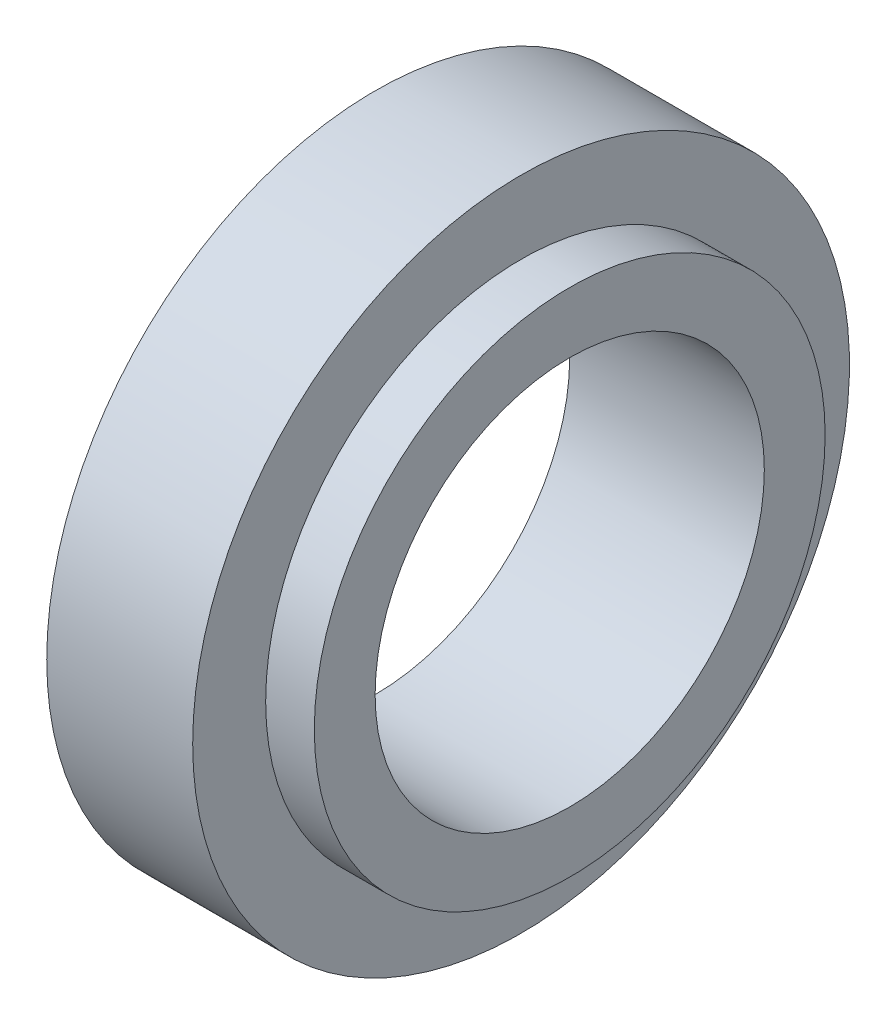
ISO-10303-21;
HEADER;
FILE_DESCRIPTION(('STEP AP214'),'2;1');
FILE_NAME('part.step','',(''),(''),'','','');
FILE_SCHEMA(('AUTOMOTIVE_DESIGN { 1 0 10303 214 1 1 1 1 }'));
ENDSEC;
DATA;
#1=APPLICATION_CONTEXT('core data for automotive mechanical design processes');
#2=APPLICATION_PROTOCOL_DEFINITION('international standard','automotive_design',2000,#1);
#3=PRODUCT_CONTEXT('',#1,'mechanical');
#4=PRODUCT('Part','Part','',(#3));
#5=PRODUCT_RELATED_PRODUCT_CATEGORY('part','',(#4));
#6=PRODUCT_DEFINITION_FORMATION('','',#4);
#7=PRODUCT_DEFINITION_CONTEXT('part definition',#1,'design');
#8=PRODUCT_DEFINITION('design','',#6,#7);
#9=PRODUCT_DEFINITION_SHAPE('','',#8);
#10=(LENGTH_UNIT() NAMED_UNIT(*) SI_UNIT(.MILLI.,.METRE.));
#11=(NAMED_UNIT(*) PLANE_ANGLE_UNIT() SI_UNIT($,.RADIAN.));
#12=(NAMED_UNIT(*) SI_UNIT($,.STERADIAN.) SOLID_ANGLE_UNIT());
#13=UNCERTAINTY_MEASURE_WITH_UNIT(LENGTH_MEASURE(1.E-05),#10,'distance_accuracy_value','');
#14=(GEOMETRIC_REPRESENTATION_CONTEXT(3) GLOBAL_UNCERTAINTY_ASSIGNED_CONTEXT((#13)) GLOBAL_UNIT_ASSIGNED_CONTEXT((#10,
#11,#12)) REPRESENTATION_CONTEXT('',''));
#15=CARTESIAN_POINT('',(0.,0.,0.));
#16=DIRECTION('',(0.,0.,1.));
#17=DIRECTION('',(1.,0.,0.));
#18=AXIS2_PLACEMENT_3D('',#15,#16,#17);
#19=CARTESIAN_POINT('',(-5.1063829787234,0.,0.));
#20=DIRECTION('',(-1.,0.,0.));
#21=DIRECTION('',(0.,0.,1.));
#22=AXIS2_PLACEMENT_3D('',#19,#20,#21);
#23=CYLINDRICAL_SURFACE('',#22,13.5);
#24=CARTESIAN_POINT('',(0.,0.,0.));
#25=DIRECTION('',(-1.,0.,0.));
#26=DIRECTION('',(0.,0.,1.));
#27=AXIS2_PLACEMENT_3D('',#24,#25,#26);
#28=CIRCLE('',#27,13.5);
#29=CARTESIAN_POINT('',(0.,0.,13.5));
#30=VERTEX_POINT('',#29);
#31=EDGE_CURVE('E64',#30,#30,#28,.T.);
#32=ORIENTED_EDGE('',*,*,#31,.F.);
#33=EDGE_LOOP('',(#32));
#34=FACE_BOUND('',#33,.T.);
#35=CARTESIAN_POINT('',(6.,0.,0.));
#36=DIRECTION('',(-1.,0.,0.));
#37=DIRECTION('',(0.,0.,1.));
#38=AXIS2_PLACEMENT_3D('',#35,#36,#37);
#39=CIRCLE('',#38,13.5);
#40=CARTESIAN_POINT('',(6.,0.,13.5));
#41=VERTEX_POINT('',#40);
#42=EDGE_CURVE('E10',#41,#41,#39,.T.);
#43=ORIENTED_EDGE('',*,*,#42,.T.);
#44=EDGE_LOOP('',(#43));
#45=FACE_BOUND('',#44,.T.);
#46=ADVANCED_FACE('F37',(#34,#45),#23,.T.);
#47=CARTESIAN_POINT('',(6.,13.5,0.));
#48=DIRECTION('',(-1.,0.,0.));
#49=DIRECTION('',(0.,0.,1.));
#50=AXIS2_PLACEMENT_3D('',#47,#48,#49);
#51=PLANE('',#50);
#52=ORIENTED_EDGE('',*,*,#42,.F.);
#53=EDGE_LOOP('',(#52));
#54=FACE_BOUND('',#53,.T.);
#55=CARTESIAN_POINT('',(6.,0.,0.));
#56=DIRECTION('',(-1.,0.,0.));
#57=DIRECTION('',(0.,0.,1.));
#58=AXIS2_PLACEMENT_3D('',#55,#56,#57);
#59=CIRCLE('',#58,10.5);
#60=CARTESIAN_POINT('',(6.,0.,10.5));
#61=VERTEX_POINT('',#60);
#62=EDGE_CURVE('E44',#61,#61,#59,.T.);
#63=ORIENTED_EDGE('',*,*,#62,.T.);
#64=EDGE_LOOP('',(#63));
#65=FACE_BOUND('',#64,.T.);
#66=ADVANCED_FACE('F72',(#54,#65),#51,.F.);
#67=CARTESIAN_POINT('',(-5.1063829787234,0.,0.));
#68=DIRECTION('',(-1.,0.,0.));
#69=DIRECTION('',(0.,0.,1.));
#70=AXIS2_PLACEMENT_3D('',#67,#68,#69);
#71=CYLINDRICAL_SURFACE('',#70,10.5);
#72=ORIENTED_EDGE('',*,*,#62,.F.);
#73=EDGE_LOOP('',(#72));
#74=FACE_BOUND('',#73,.T.);
#75=CARTESIAN_POINT('',(8.,0.,0.));
#76=DIRECTION('',(-1.,0.,0.));
#77=DIRECTION('',(0.,0.,1.));
#78=AXIS2_PLACEMENT_3D('',#75,#76,#77);
#79=CIRCLE('',#78,10.5);
#80=CARTESIAN_POINT('',(8.,0.,10.5));
#81=VERTEX_POINT('',#80);
#82=EDGE_CURVE('E49',#81,#81,#79,.T.);
#83=ORIENTED_EDGE('',*,*,#82,.T.);
#84=EDGE_LOOP('',(#83));
#85=FACE_BOUND('',#84,.T.);
#86=ADVANCED_FACE('F76',(#74,#85),#71,.T.);
#87=CARTESIAN_POINT('',(8.,10.5,0.));
#88=DIRECTION('',(-1.,0.,0.));
#89=DIRECTION('',(0.,0.,1.));
#90=AXIS2_PLACEMENT_3D('',#87,#88,#89);
#91=PLANE('',#90);
#92=ORIENTED_EDGE('',*,*,#82,.F.);
#93=EDGE_LOOP('',(#92));
#94=FACE_BOUND('',#93,.T.);
#95=CARTESIAN_POINT('',(8.,0.,0.));
#96=DIRECTION('',(-1.,0.,0.));
#97=DIRECTION('',(0.,0.,1.));
#98=AXIS2_PLACEMENT_3D('',#95,#96,#97);
#99=CIRCLE('',#98,8.);
#100=CARTESIAN_POINT('',(8.,0.,8.));
#101=VERTEX_POINT('',#100);
#102=EDGE_CURVE('E54',#101,#101,#99,.T.);
#103=ORIENTED_EDGE('',*,*,#102,.T.);
#104=EDGE_LOOP('',(#103));
#105=FACE_BOUND('',#104,.T.);
#106=ADVANCED_FACE('F81',(#94,#105),#91,.F.);
#107=CARTESIAN_POINT('',(-5.1063829787234,0.,0.));
#108=DIRECTION('',(-1.,0.,0.));
#109=DIRECTION('',(0.,0.,1.));
#110=AXIS2_PLACEMENT_3D('',#107,#108,#109);
#111=CYLINDRICAL_SURFACE('',#110,8.);
#112=ORIENTED_EDGE('',*,*,#102,.F.);
#113=EDGE_LOOP('',(#112));
#114=FACE_BOUND('',#113,.T.);
#115=CARTESIAN_POINT('',(0.,0.,0.));
#116=DIRECTION('',(-1.,0.,0.));
#117=DIRECTION('',(0.,0.,1.));
#118=AXIS2_PLACEMENT_3D('',#115,#116,#117);
#119=CIRCLE('',#118,8.);
#120=CARTESIAN_POINT('',(0.,0.,8.));
#121=VERTEX_POINT('',#120);
#122=EDGE_CURVE('E60',#121,#121,#119,.T.);
#123=ORIENTED_EDGE('',*,*,#122,.T.);
#124=EDGE_LOOP('',(#123));
#125=FACE_BOUND('',#124,.T.);
#126=ADVANCED_FACE('F87',(#114,#125),#111,.F.);
#127=CARTESIAN_POINT('',(0.,8.,0.));
#128=DIRECTION('',(1.,0.,0.));
#129=DIRECTION('',(0.,0.,-1.));
#130=AXIS2_PLACEMENT_3D('',#127,#128,#129);
#131=PLANE('',#130);
#132=ORIENTED_EDGE('',*,*,#122,.F.);
#133=EDGE_LOOP('',(#132));
#134=FACE_BOUND('',#133,.T.);
#135=ORIENTED_EDGE('',*,*,#31,.T.);
#136=EDGE_LOOP('',(#135));
#137=FACE_BOUND('',#136,.T.);
#138=ADVANCED_FACE('F69',(#134,#137),#131,.F.);
#139=CLOSED_SHELL('',(#46,#66,#86,#106,#126,#138));
#140=MANIFOLD_SOLID_BREP('B2',#139);
#141=ADVANCED_BREP_SHAPE_REPRESENTATION('',(#18,#140),#14);
#142=SHAPE_DEFINITION_REPRESENTATION(#9,#141);
ENDSEC;
END-ISO-10303-21;
